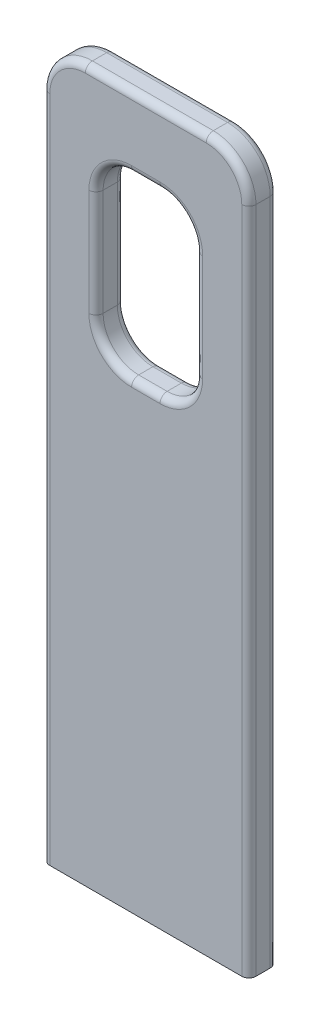
ISO-10303-21;
HEADER;
FILE_DESCRIPTION(('STEP AP214'),'2;1');
FILE_NAME('part.step','',(''),(''),'','','');
FILE_SCHEMA(('AUTOMOTIVE_DESIGN { 1 0 10303 214 1 1 1 1 }'));
ENDSEC;
DATA;
#1=APPLICATION_CONTEXT('core data for automotive mechanical design processes');
#2=APPLICATION_PROTOCOL_DEFINITION('international standard','automotive_design',2000,#1);
#3=PRODUCT_CONTEXT('',#1,'mechanical');
#4=PRODUCT('Part','Part','',(#3));
#5=PRODUCT_RELATED_PRODUCT_CATEGORY('part','',(#4));
#6=PRODUCT_DEFINITION_FORMATION('','',#4);
#7=PRODUCT_DEFINITION_CONTEXT('part definition',#1,'design');
#8=PRODUCT_DEFINITION('design','',#6,#7);
#9=PRODUCT_DEFINITION_SHAPE('','',#8);
#10=(LENGTH_UNIT() NAMED_UNIT(*) SI_UNIT(.MILLI.,.METRE.));
#11=(NAMED_UNIT(*) PLANE_ANGLE_UNIT() SI_UNIT($,.RADIAN.));
#12=(NAMED_UNIT(*) SI_UNIT($,.STERADIAN.) SOLID_ANGLE_UNIT());
#13=UNCERTAINTY_MEASURE_WITH_UNIT(LENGTH_MEASURE(1.E-05),#10,'distance_accuracy_value','');
#14=(GEOMETRIC_REPRESENTATION_CONTEXT(3) GLOBAL_UNCERTAINTY_ASSIGNED_CONTEXT((#13)) GLOBAL_UNIT_ASSIGNED_CONTEXT((#10,
#11,#12)) REPRESENTATION_CONTEXT('',''));
#15=CARTESIAN_POINT('',(0.,0.,0.));
#16=DIRECTION('',(0.,0.,1.));
#17=DIRECTION('',(1.,0.,0.));
#18=AXIS2_PLACEMENT_3D('',#15,#16,#17);
#19=CARTESIAN_POINT('',(-1.45,0.,0.2));
#20=DIRECTION('',(0.,0.,1.));
#21=DIRECTION('',(1.,0.,0.));
#22=AXIS2_PLACEMENT_3D('',#19,#20,#21);
#23=PLANE('',#22);
#24=DIRECTION('',(0.,-1.,0.));
#25=VECTOR('',#24,1.);
#26=CARTESIAN_POINT('',(-0.800000000000001,0.,0.2));
#27=LINE('',#26,#25);
#28=CARTESIAN_POINT('',(-0.8,7.,0.2));
#29=VERTEX_POINT('',#28);
#30=CARTESIAN_POINT('',(-0.8,8.5,0.2));
#31=VERTEX_POINT('',#30);
#32=EDGE_CURVE('E239',#29,#31,#27,.F.);
#33=ORIENTED_EDGE('',*,*,#32,.T.);
#34=CARTESIAN_POINT('',(-0.2,8.5,0.2));
#35=DIRECTION('',(0.,0.,1.));
#36=DIRECTION('',(1.,0.,0.));
#37=AXIS2_PLACEMENT_3D('',#34,#35,#36);
#38=CIRCLE('',#37,0.6);
#39=CARTESIAN_POINT('',(-0.2,9.1,0.2));
#40=VERTEX_POINT('',#39);
#41=EDGE_CURVE('E310',#31,#40,#38,.F.);
#42=ORIENTED_EDGE('',*,*,#41,.T.);
#43=DIRECTION('',(-1.,0.,0.));
#44=VECTOR('',#43,1.);
#45=CARTESIAN_POINT('',(-1.45,9.1,0.2));
#46=LINE('',#45,#44);
#47=CARTESIAN_POINT('',(0.2,9.1,0.2));
#48=VERTEX_POINT('',#47);
#49=EDGE_CURVE('E308',#40,#48,#46,.F.);
#50=ORIENTED_EDGE('',*,*,#49,.T.);
#51=CARTESIAN_POINT('',(0.2,8.5,0.2));
#52=DIRECTION('',(0.,0.,1.));
#53=DIRECTION('',(1.,0.,0.));
#54=AXIS2_PLACEMENT_3D('',#51,#52,#53);
#55=CIRCLE('',#54,0.6);
#56=CARTESIAN_POINT('',(0.8,8.5,0.2));
#57=VERTEX_POINT('',#56);
#58=EDGE_CURVE('E306',#48,#57,#55,.F.);
#59=ORIENTED_EDGE('',*,*,#58,.T.);
#60=DIRECTION('',(0.,1.,0.));
#61=VECTOR('',#60,1.);
#62=CARTESIAN_POINT('',(0.800000000000001,0.,0.2));
#63=LINE('',#62,#61);
#64=CARTESIAN_POINT('',(0.8,7.,0.2));
#65=VERTEX_POINT('',#64);
#66=EDGE_CURVE('E304',#57,#65,#63,.F.);
#67=ORIENTED_EDGE('',*,*,#66,.T.);
#68=CARTESIAN_POINT('',(0.2,7.,0.2));
#69=DIRECTION('',(0.,0.,1.));
#70=DIRECTION('',(1.,0.,0.));
#71=AXIS2_PLACEMENT_3D('',#68,#69,#70);
#72=CIRCLE('',#71,0.6);
#73=CARTESIAN_POINT('',(0.2,6.4,0.2));
#74=VERTEX_POINT('',#73);
#75=EDGE_CURVE('E302',#65,#74,#72,.F.);
#76=ORIENTED_EDGE('',*,*,#75,.T.);
#77=DIRECTION('',(1.,0.,0.));
#78=VECTOR('',#77,1.);
#79=CARTESIAN_POINT('',(-1.44999999999999,6.4,0.2));
#80=LINE('',#79,#78);
#81=CARTESIAN_POINT('',(-0.2,6.4,0.2));
#82=VERTEX_POINT('',#81);
#83=EDGE_CURVE('E300',#74,#82,#80,.F.);
#84=ORIENTED_EDGE('',*,*,#83,.T.);
#85=CARTESIAN_POINT('',(-0.2,7.,0.2));
#86=DIRECTION('',(0.,0.,1.));
#87=DIRECTION('',(1.,0.,0.));
#88=AXIS2_PLACEMENT_3D('',#85,#86,#87);
#89=CIRCLE('',#88,0.6);
#90=EDGE_CURVE('E298',#82,#29,#89,.F.);
#91=ORIENTED_EDGE('',*,*,#90,.T.);
#92=EDGE_LOOP('',(#33,#42,#50,#59,#67,#76,#84,#91));
#93=FACE_BOUND('',#92,.T.);
#94=CARTESIAN_POINT('',(-0.849999999999997,9.4,0.2));
#95=DIRECTION('',(0.,0.,1.));
#96=DIRECTION('',(1.,0.,0.));
#97=AXIS2_PLACEMENT_3D('',#94,#95,#96);
#98=CIRCLE('',#97,0.5);
#99=CARTESIAN_POINT('',(-0.849999999999997,9.9,0.2));
#100=VERTEX_POINT('',#99);
#101=CARTESIAN_POINT('',(-1.35,9.4,0.2));
#102=VERTEX_POINT('',#101);
#103=EDGE_CURVE('E237',#100,#102,#98,.T.);
#104=ORIENTED_EDGE('',*,*,#103,.T.);
#105=DIRECTION('',(0.,-1.,0.));
#106=VECTOR('',#105,1.);
#107=CARTESIAN_POINT('',(-1.35,0.,0.2));
#108=LINE('',#107,#106);
#109=CARTESIAN_POINT('',(-1.35,0.,0.2));
#110=VERTEX_POINT('',#109);
#111=EDGE_CURVE('E223',#102,#110,#108,.T.);
#112=ORIENTED_EDGE('',*,*,#111,.T.);
#113=DIRECTION('',(1.,0.,0.));
#114=VECTOR('',#113,1.);
#115=CARTESIAN_POINT('',(-1.45,0.,0.2));
#116=LINE('',#115,#114);
#117=CARTESIAN_POINT('',(1.35,0.,0.2));
#118=VERTEX_POINT('',#117);
#119=EDGE_CURVE('E234',#110,#118,#116,.T.);
#120=ORIENTED_EDGE('',*,*,#119,.T.);
#121=DIRECTION('',(0.,1.,0.));
#122=VECTOR('',#121,1.);
#123=CARTESIAN_POINT('',(1.35,9.4,0.2));
#124=LINE('',#123,#122);
#125=CARTESIAN_POINT('',(1.35,9.4,0.2));
#126=VERTEX_POINT('',#125);
#127=EDGE_CURVE('E290',#118,#126,#124,.T.);
#128=ORIENTED_EDGE('',*,*,#127,.T.);
#129=CARTESIAN_POINT('',(0.850000000000003,9.4,0.2));
#130=DIRECTION('',(0.,0.,1.));
#131=DIRECTION('',(1.,0.,0.));
#132=AXIS2_PLACEMENT_3D('',#129,#130,#131);
#133=CIRCLE('',#132,0.5);
#134=CARTESIAN_POINT('',(0.850000000000003,9.9,0.2));
#135=VERTEX_POINT('',#134);
#136=EDGE_CURVE('E292',#126,#135,#133,.T.);
#137=ORIENTED_EDGE('',*,*,#136,.T.);
#138=DIRECTION('',(-1.,0.,0.));
#139=VECTOR('',#138,1.);
#140=CARTESIAN_POINT('',(-0.849999999999997,9.9,0.2));
#141=LINE('',#140,#139);
#142=EDGE_CURVE('E294',#135,#100,#141,.T.);
#143=ORIENTED_EDGE('',*,*,#142,.T.);
#144=EDGE_LOOP('',(#104,#112,#120,#128,#137,#143));
#145=FACE_BOUND('',#144,.T.);
#146=ADVANCED_FACE('F32',(#93,#145),#23,.T.);
#147=CARTESIAN_POINT('',(-1.45,0.,-0.2));
#148=DIRECTION('',(0.,0.,1.));
#149=DIRECTION('',(1.,0.,0.));
#150=AXIS2_PLACEMENT_3D('',#147,#148,#149);
#151=PLANE('',#150);
#152=DIRECTION('',(-1.,0.,0.));
#153=VECTOR('',#152,1.);
#154=CARTESIAN_POINT('',(-0.2,9.1,-0.2));
#155=LINE('',#154,#153);
#156=CARTESIAN_POINT('',(0.2,9.1,-0.2));
#157=VERTEX_POINT('',#156);
#158=CARTESIAN_POINT('',(-0.2,9.1,-0.2));
#159=VERTEX_POINT('',#158);
#160=EDGE_CURVE('E365',#157,#159,#155,.T.);
#161=ORIENTED_EDGE('',*,*,#160,.T.);
#162=CARTESIAN_POINT('',(-0.2,8.5,-0.2));
#163=DIRECTION('',(0.,0.,1.));
#164=DIRECTION('',(1.,0.,0.));
#165=AXIS2_PLACEMENT_3D('',#162,#163,#164);
#166=CIRCLE('',#165,0.6);
#167=CARTESIAN_POINT('',(-0.8,8.5,-0.2));
#168=VERTEX_POINT('',#167);
#169=EDGE_CURVE('E367',#159,#168,#166,.T.);
#170=ORIENTED_EDGE('',*,*,#169,.T.);
#171=DIRECTION('',(0.,-1.,0.));
#172=VECTOR('',#171,1.);
#173=CARTESIAN_POINT('',(-0.8,7.,-0.2));
#174=LINE('',#173,#172);
#175=CARTESIAN_POINT('',(-0.8,7.,-0.2));
#176=VERTEX_POINT('',#175);
#177=EDGE_CURVE('E353',#168,#176,#174,.T.);
#178=ORIENTED_EDGE('',*,*,#177,.T.);
#179=CARTESIAN_POINT('',(-0.2,7.,-0.2));
#180=DIRECTION('',(0.,0.,1.));
#181=DIRECTION('',(1.,0.,0.));
#182=AXIS2_PLACEMENT_3D('',#179,#180,#181);
#183=CIRCLE('',#182,0.6);
#184=CARTESIAN_POINT('',(-0.2,6.4,-0.2));
#185=VERTEX_POINT('',#184);
#186=EDGE_CURVE('E355',#176,#185,#183,.T.);
#187=ORIENTED_EDGE('',*,*,#186,.T.);
#188=DIRECTION('',(1.,0.,0.));
#189=VECTOR('',#188,1.);
#190=CARTESIAN_POINT('',(0.2,6.4,-0.2));
#191=LINE('',#190,#189);
#192=CARTESIAN_POINT('',(0.2,6.4,-0.2));
#193=VERTEX_POINT('',#192);
#194=EDGE_CURVE('E357',#185,#193,#191,.T.);
#195=ORIENTED_EDGE('',*,*,#194,.T.);
#196=CARTESIAN_POINT('',(0.2,7.,-0.2));
#197=DIRECTION('',(0.,0.,1.));
#198=DIRECTION('',(1.,0.,0.));
#199=AXIS2_PLACEMENT_3D('',#196,#197,#198);
#200=CIRCLE('',#199,0.6);
#201=CARTESIAN_POINT('',(0.8,7.,-0.2));
#202=VERTEX_POINT('',#201);
#203=EDGE_CURVE('E359',#193,#202,#200,.T.);
#204=ORIENTED_EDGE('',*,*,#203,.T.);
#205=DIRECTION('',(0.,1.,0.));
#206=VECTOR('',#205,1.);
#207=CARTESIAN_POINT('',(0.8,8.5,-0.2));
#208=LINE('',#207,#206);
#209=CARTESIAN_POINT('',(0.8,8.5,-0.2));
#210=VERTEX_POINT('',#209);
#211=EDGE_CURVE('E361',#202,#210,#208,.T.);
#212=ORIENTED_EDGE('',*,*,#211,.T.);
#213=CARTESIAN_POINT('',(0.2,8.5,-0.2));
#214=DIRECTION('',(0.,0.,1.));
#215=DIRECTION('',(1.,0.,0.));
#216=AXIS2_PLACEMENT_3D('',#213,#214,#215);
#217=CIRCLE('',#216,0.6);
#218=EDGE_CURVE('E363',#210,#157,#217,.T.);
#219=ORIENTED_EDGE('',*,*,#218,.T.);
#220=EDGE_LOOP('',(#161,#170,#178,#187,#195,#204,#212,#219));
#221=FACE_BOUND('',#220,.T.);
#222=DIRECTION('',(1.,0.,0.));
#223=VECTOR('',#222,1.);
#224=CARTESIAN_POINT('',(-1.45,0.,-0.2));
#225=LINE('',#224,#223);
#226=CARTESIAN_POINT('',(-1.35,0.,-0.2));
#227=VERTEX_POINT('',#226);
#228=CARTESIAN_POINT('',(1.35,0.,-0.2));
#229=VERTEX_POINT('',#228);
#230=EDGE_CURVE('E246',#227,#229,#225,.T.);
#231=ORIENTED_EDGE('',*,*,#230,.F.);
#232=DIRECTION('',(0.,-1.,0.));
#233=VECTOR('',#232,1.);
#234=CARTESIAN_POINT('',(-1.35,0.,-0.2));
#235=LINE('',#234,#233);
#236=CARTESIAN_POINT('',(-1.35,9.4,-0.2));
#237=VERTEX_POINT('',#236);
#238=EDGE_CURVE('E351',#227,#237,#235,.F.);
#239=ORIENTED_EDGE('',*,*,#238,.T.);
#240=CARTESIAN_POINT('',(-0.849999999999997,9.4,-0.2));
#241=DIRECTION('',(0.,0.,1.));
#242=DIRECTION('',(1.,0.,0.));
#243=AXIS2_PLACEMENT_3D('',#240,#241,#242);
#244=CIRCLE('',#243,0.5);
#245=CARTESIAN_POINT('',(-0.849999999999997,9.9,-0.2));
#246=VERTEX_POINT('',#245);
#247=EDGE_CURVE('E349',#237,#246,#244,.F.);
#248=ORIENTED_EDGE('',*,*,#247,.T.);
#249=DIRECTION('',(-1.,0.,0.));
#250=VECTOR('',#249,1.);
#251=CARTESIAN_POINT('',(-1.45,9.9,-0.2));
#252=LINE('',#251,#250);
#253=CARTESIAN_POINT('',(0.850000000000003,9.9,-0.2));
#254=VERTEX_POINT('',#253);
#255=EDGE_CURVE('E347',#246,#254,#252,.F.);
#256=ORIENTED_EDGE('',*,*,#255,.T.);
#257=CARTESIAN_POINT('',(0.850000000000003,9.4,-0.2));
#258=DIRECTION('',(0.,0.,1.));
#259=DIRECTION('',(1.,0.,0.));
#260=AXIS2_PLACEMENT_3D('',#257,#258,#259);
#261=CIRCLE('',#260,0.5);
#262=CARTESIAN_POINT('',(1.35,9.4,-0.2));
#263=VERTEX_POINT('',#262);
#264=EDGE_CURVE('E345',#254,#263,#261,.F.);
#265=ORIENTED_EDGE('',*,*,#264,.T.);
#266=DIRECTION('',(0.,1.,0.));
#267=VECTOR('',#266,1.);
#268=CARTESIAN_POINT('',(1.35,0.,-0.2));
#269=LINE('',#268,#267);
#270=EDGE_CURVE('E343',#263,#229,#269,.F.);
#271=ORIENTED_EDGE('',*,*,#270,.T.);
#272=EDGE_LOOP('',(#231,#239,#248,#256,#265,#271));
#273=FACE_BOUND('',#272,.T.);
#274=ADVANCED_FACE('F503',(#221,#273),#151,.F.);
#275=CARTESIAN_POINT('',(-1.45,10.,0.2));
#276=DIRECTION('',(1.,0.,0.));
#277=DIRECTION('',(0.,1.,0.));
#278=AXIS2_PLACEMENT_3D('',#275,#276,#277);
#279=PLANE('',#278);
#280=DIRECTION('',(0.,0.,-1.));
#281=VECTOR('',#280,1.);
#282=CARTESIAN_POINT('',(-1.45,9.4,0.2));
#283=LINE('',#282,#281);
#284=CARTESIAN_POINT('',(-1.45,9.4,0.1));
#285=VERTEX_POINT('',#284);
#286=CARTESIAN_POINT('',(-1.45,9.4,-0.1));
#287=VERTEX_POINT('',#286);
#288=EDGE_CURVE('E287',#285,#287,#283,.T.);
#289=ORIENTED_EDGE('',*,*,#288,.T.);
#290=DIRECTION('',(0.,-1.,0.));
#291=VECTOR('',#290,1.);
#292=CARTESIAN_POINT('',(-1.45,10.,-0.1));
#293=LINE('',#292,#291);
#294=CARTESIAN_POINT('',(-1.45,0.,-0.1));
#295=VERTEX_POINT('',#294);
#296=EDGE_CURVE('E371',#287,#295,#293,.T.);
#297=ORIENTED_EDGE('',*,*,#296,.T.);
#298=DIRECTION('',(0.,0.,-1.));
#299=VECTOR('',#298,1.);
#300=CARTESIAN_POINT('',(-1.45,0.,0.2));
#301=LINE('',#300,#299);
#302=CARTESIAN_POINT('',(-1.45,0.,0.1));
#303=VERTEX_POINT('',#302);
#304=EDGE_CURVE('E248',#303,#295,#301,.T.);
#305=ORIENTED_EDGE('',*,*,#304,.F.);
#306=DIRECTION('',(0.,-1.,0.));
#307=VECTOR('',#306,1.);
#308=CARTESIAN_POINT('',(-1.45,9.4,0.1));
#309=LINE('',#308,#307);
#310=EDGE_CURVE('E224',#303,#285,#309,.F.);
#311=ORIENTED_EDGE('',*,*,#310,.T.);
#312=EDGE_LOOP('',(#289,#297,#305,#311));
#313=FACE_BOUND('',#312,.T.);
#314=ADVANCED_FACE('F494',(#313),#279,.F.);
#315=CARTESIAN_POINT('',(-1.45,0.,0.2));
#316=DIRECTION('',(0.,1.,0.));
#317=DIRECTION('',(0.,0.,1.));
#318=AXIS2_PLACEMENT_3D('',#315,#316,#317);
#319=PLANE('',#318);
#320=ORIENTED_EDGE('',*,*,#304,.T.);
#321=CARTESIAN_POINT('',(-1.35,0.,-0.1));
#322=DIRECTION('',(0.,1.,0.));
#323=DIRECTION('',(0.,0.,1.));
#324=AXIS2_PLACEMENT_3D('',#321,#322,#323);
#325=CIRCLE('',#324,0.1);
#326=EDGE_CURVE('E229',#295,#227,#325,.F.);
#327=ORIENTED_EDGE('',*,*,#326,.T.);
#328=ORIENTED_EDGE('',*,*,#230,.T.);
#329=CARTESIAN_POINT('',(1.35,0.,-0.1));
#330=DIRECTION('',(0.,1.,0.));
#331=DIRECTION('',(0.,0.,1.));
#332=AXIS2_PLACEMENT_3D('',#329,#330,#331);
#333=CIRCLE('',#332,0.1);
#334=CARTESIAN_POINT('',(1.45,0.,-0.1));
#335=VERTEX_POINT('',#334);
#336=EDGE_CURVE('E230',#229,#335,#333,.F.);
#337=ORIENTED_EDGE('',*,*,#336,.T.);
#338=DIRECTION('',(0.,0.,-1.));
#339=VECTOR('',#338,1.);
#340=CARTESIAN_POINT('',(1.45,0.,0.2));
#341=LINE('',#340,#339);
#342=CARTESIAN_POINT('',(1.45,0.,0.1));
#343=VERTEX_POINT('',#342);
#344=EDGE_CURVE('E245',#343,#335,#341,.T.);
#345=ORIENTED_EDGE('',*,*,#344,.F.);
#346=CARTESIAN_POINT('',(1.35,0.,0.1));
#347=DIRECTION('',(0.,1.,0.));
#348=DIRECTION('',(0.,0.,1.));
#349=AXIS2_PLACEMENT_3D('',#346,#347,#348);
#350=CIRCLE('',#349,0.1);
#351=EDGE_CURVE('E244',#343,#118,#350,.F.);
#352=ORIENTED_EDGE('',*,*,#351,.T.);
#353=ORIENTED_EDGE('',*,*,#119,.F.);
#354=CARTESIAN_POINT('',(-1.35,0.,0.1));
#355=DIRECTION('',(0.,1.,0.));
#356=DIRECTION('',(0.,0.,1.));
#357=AXIS2_PLACEMENT_3D('',#354,#355,#356);
#358=CIRCLE('',#357,0.1);
#359=EDGE_CURVE('E219',#110,#303,#358,.F.);
#360=ORIENTED_EDGE('',*,*,#359,.T.);
#361=EDGE_LOOP('',(#320,#327,#328,#337,#345,#352,#353,#360));
#362=FACE_BOUND('',#361,.T.);
#363=ADVANCED_FACE('F241',(#362),#319,.F.);
#364=CARTESIAN_POINT('',(1.45,10.,0.2));
#365=DIRECTION('',(-1.,0.,0.));
#366=DIRECTION('',(0.,-1.,0.));
#367=AXIS2_PLACEMENT_3D('',#364,#365,#366);
#368=PLANE('',#367);
#369=ORIENTED_EDGE('',*,*,#344,.T.);
#370=DIRECTION('',(0.,1.,0.));
#371=VECTOR('',#370,1.);
#372=CARTESIAN_POINT('',(1.45,10.,-0.1));
#373=LINE('',#372,#371);
#374=CARTESIAN_POINT('',(1.45,9.4,-0.1));
#375=VERTEX_POINT('',#374);
#376=EDGE_CURVE('E11',#335,#375,#373,.T.);
#377=ORIENTED_EDGE('',*,*,#376,.T.);
#378=DIRECTION('',(0.,0.,-1.));
#379=VECTOR('',#378,1.);
#380=CARTESIAN_POINT('',(1.45,9.4,0.2));
#381=LINE('',#380,#379);
#382=CARTESIAN_POINT('',(1.45,9.4,0.1));
#383=VERTEX_POINT('',#382);
#384=EDGE_CURVE('E285',#375,#383,#381,.F.);
#385=ORIENTED_EDGE('',*,*,#384,.T.);
#386=DIRECTION('',(0.,1.,0.));
#387=VECTOR('',#386,1.);
#388=CARTESIAN_POINT('',(1.45,0.,0.1));
#389=LINE('',#388,#387);
#390=EDGE_CURVE('E41',#383,#343,#389,.F.);
#391=ORIENTED_EDGE('',*,*,#390,.T.);
#392=EDGE_LOOP('',(#369,#377,#385,#391));
#393=FACE_BOUND('',#392,.T.);
#394=ADVANCED_FACE('F465',(#393),#368,.F.);
#395=CARTESIAN_POINT('',(-1.45,10.,0.2));
#396=DIRECTION('',(0.,-1.,0.));
#397=DIRECTION('',(0.,0.,-1.));
#398=AXIS2_PLACEMENT_3D('',#395,#396,#397);
#399=PLANE('',#398);
#400=DIRECTION('',(0.,0.,-1.));
#401=VECTOR('',#400,1.);
#402=CARTESIAN_POINT('',(0.850000000000003,10.,0.2));
#403=LINE('',#402,#401);
#404=CARTESIAN_POINT('',(0.850000000000003,10.,0.1));
#405=VERTEX_POINT('',#404);
#406=CARTESIAN_POINT('',(0.850000000000003,10.,-0.1));
#407=VERTEX_POINT('',#406);
#408=EDGE_CURVE('E282',#405,#407,#403,.T.);
#409=ORIENTED_EDGE('',*,*,#408,.T.);
#410=DIRECTION('',(-1.,0.,0.));
#411=VECTOR('',#410,1.);
#412=CARTESIAN_POINT('',(-1.45,10.,-0.1));
#413=LINE('',#412,#411);
#414=CARTESIAN_POINT('',(-0.849999999999997,10.,-0.1));
#415=VERTEX_POINT('',#414);
#416=EDGE_CURVE('E383',#407,#415,#413,.T.);
#417=ORIENTED_EDGE('',*,*,#416,.T.);
#418=DIRECTION('',(0.,0.,-1.));
#419=VECTOR('',#418,1.);
#420=CARTESIAN_POINT('',(-0.849999999999997,10.,0.2));
#421=LINE('',#420,#419);
#422=CARTESIAN_POINT('',(-0.849999999999997,10.,0.1));
#423=VERTEX_POINT('',#422);
#424=EDGE_CURVE('E279',#415,#423,#421,.F.);
#425=ORIENTED_EDGE('',*,*,#424,.T.);
#426=DIRECTION('',(-1.,0.,0.));
#427=VECTOR('',#426,1.);
#428=CARTESIAN_POINT('',(0.850000000000003,10.,0.1));
#429=LINE('',#428,#427);
#430=EDGE_CURVE('E381',#423,#405,#429,.F.);
#431=ORIENTED_EDGE('',*,*,#430,.T.);
#432=EDGE_LOOP('',(#409,#417,#425,#431));
#433=FACE_BOUND('',#432,.T.);
#434=ADVANCED_FACE('F480',(#433),#399,.F.);
#435=CARTESIAN_POINT('',(-0.7,9.,0.2));
#436=DIRECTION('',(1.,0.,0.));
#437=DIRECTION('',(0.,1.,0.));
#438=AXIS2_PLACEMENT_3D('',#435,#436,#437);
#439=PLANE('',#438);
#440=DIRECTION('',(0.,0.,-1.));
#441=VECTOR('',#440,1.);
#442=CARTESIAN_POINT('',(-0.7,8.5,0.2));
#443=LINE('',#442,#441);
#444=CARTESIAN_POINT('',(-0.7,8.5,-0.1));
#445=VERTEX_POINT('',#444);
#446=CARTESIAN_POINT('',(-0.7,8.5,0.1));
#447=VERTEX_POINT('',#446);
#448=EDGE_CURVE('E276',#445,#447,#443,.F.);
#449=ORIENTED_EDGE('',*,*,#448,.T.);
#450=DIRECTION('',(0.,-1.,0.));
#451=VECTOR('',#450,1.);
#452=CARTESIAN_POINT('',(-0.7,9.,0.1));
#453=LINE('',#452,#451);
#454=CARTESIAN_POINT('',(-0.7,7.,0.1));
#455=VERTEX_POINT('',#454);
#456=EDGE_CURVE('E390',#447,#455,#453,.T.);
#457=ORIENTED_EDGE('',*,*,#456,.T.);
#458=DIRECTION('',(0.,0.,-1.));
#459=VECTOR('',#458,1.);
#460=CARTESIAN_POINT('',(-0.7,7.,-0.2));
#461=LINE('',#460,#459);
#462=CARTESIAN_POINT('',(-0.7,7.,-0.1));
#463=VERTEX_POINT('',#462);
#464=EDGE_CURVE('E273',#455,#463,#461,.T.);
#465=ORIENTED_EDGE('',*,*,#464,.T.);
#466=DIRECTION('',(0.,-1.,0.));
#467=VECTOR('',#466,1.);
#468=CARTESIAN_POINT('',(-0.7,8.5,-0.1));
#469=LINE('',#468,#467);
#470=EDGE_CURVE('E388',#463,#445,#469,.F.);
#471=ORIENTED_EDGE('',*,*,#470,.T.);
#472=EDGE_LOOP('',(#449,#457,#465,#471));
#473=FACE_BOUND('',#472,.T.);
#474=ADVANCED_FACE('F524',(#473),#439,.T.);
#475=CARTESIAN_POINT('',(-0.7,6.5,0.2));
#476=DIRECTION('',(0.,1.,0.));
#477=DIRECTION('',(-1.,0.,0.));
#478=AXIS2_PLACEMENT_3D('',#475,#476,#477);
#479=PLANE('',#478);
#480=DIRECTION('',(0.,0.,-1.));
#481=VECTOR('',#480,1.);
#482=CARTESIAN_POINT('',(-0.2,6.5,0.2));
#483=LINE('',#482,#481);
#484=CARTESIAN_POINT('',(-0.2,6.5,-0.1));
#485=VERTEX_POINT('',#484);
#486=CARTESIAN_POINT('',(-0.2,6.5,0.1));
#487=VERTEX_POINT('',#486);
#488=EDGE_CURVE('E255',#485,#487,#483,.F.);
#489=ORIENTED_EDGE('',*,*,#488,.T.);
#490=DIRECTION('',(1.,0.,0.));
#491=VECTOR('',#490,1.);
#492=CARTESIAN_POINT('',(-0.7,6.5,0.1));
#493=LINE('',#492,#491);
#494=CARTESIAN_POINT('',(0.2,6.5,0.1));
#495=VERTEX_POINT('',#494);
#496=EDGE_CURVE('E337',#487,#495,#493,.T.);
#497=ORIENTED_EDGE('',*,*,#496,.T.);
#498=DIRECTION('',(0.,0.,-1.));
#499=VECTOR('',#498,1.);
#500=CARTESIAN_POINT('',(0.2,6.5,-0.2));
#501=LINE('',#500,#499);
#502=CARTESIAN_POINT('',(0.2,6.5,-0.1));
#503=VERTEX_POINT('',#502);
#504=EDGE_CURVE('E258',#495,#503,#501,.T.);
#505=ORIENTED_EDGE('',*,*,#504,.T.);
#506=DIRECTION('',(1.,0.,0.));
#507=VECTOR('',#506,1.);
#508=CARTESIAN_POINT('',(-0.2,6.5,-0.1));
#509=LINE('',#508,#507);
#510=EDGE_CURVE('E335',#503,#485,#509,.F.);
#511=ORIENTED_EDGE('',*,*,#510,.T.);
#512=EDGE_LOOP('',(#489,#497,#505,#511));
#513=FACE_BOUND('',#512,.T.);
#514=ADVANCED_FACE('F827',(#513),#479,.T.);
#515=CARTESIAN_POINT('',(0.7,9.,0.2));
#516=DIRECTION('',(-1.,0.,0.));
#517=DIRECTION('',(0.,-1.,0.));
#518=AXIS2_PLACEMENT_3D('',#515,#516,#517);
#519=PLANE('',#518);
#520=DIRECTION('',(0.,0.,-1.));
#521=VECTOR('',#520,1.);
#522=CARTESIAN_POINT('',(0.7,7.,0.2));
#523=LINE('',#522,#521);
#524=CARTESIAN_POINT('',(0.7,7.,-0.1));
#525=VERTEX_POINT('',#524);
#526=CARTESIAN_POINT('',(0.7,7.,0.1));
#527=VERTEX_POINT('',#526);
#528=EDGE_CURVE('E264',#525,#527,#523,.F.);
#529=ORIENTED_EDGE('',*,*,#528,.T.);
#530=DIRECTION('',(0.,1.,0.));
#531=VECTOR('',#530,1.);
#532=CARTESIAN_POINT('',(0.7,9.,0.1));
#533=LINE('',#532,#531);
#534=CARTESIAN_POINT('',(0.7,8.5,0.1));
#535=VERTEX_POINT('',#534);
#536=EDGE_CURVE('E329',#527,#535,#533,.T.);
#537=ORIENTED_EDGE('',*,*,#536,.T.);
#538=DIRECTION('',(0.,0.,-1.));
#539=VECTOR('',#538,1.);
#540=CARTESIAN_POINT('',(0.7,8.5,-0.2));
#541=LINE('',#540,#539);
#542=CARTESIAN_POINT('',(0.7,8.5,-0.1));
#543=VERTEX_POINT('',#542);
#544=EDGE_CURVE('E261',#535,#543,#541,.T.);
#545=ORIENTED_EDGE('',*,*,#544,.T.);
#546=DIRECTION('',(0.,1.,0.));
#547=VECTOR('',#546,1.);
#548=CARTESIAN_POINT('',(0.7,7.,-0.1));
#549=LINE('',#548,#547);
#550=EDGE_CURVE('E327',#543,#525,#549,.F.);
#551=ORIENTED_EDGE('',*,*,#550,.T.);
#552=EDGE_LOOP('',(#529,#537,#545,#551));
#553=FACE_BOUND('',#552,.T.);
#554=ADVANCED_FACE('F819',(#553),#519,.T.);
#555=CARTESIAN_POINT('',(-0.7,9.,0.2));
#556=DIRECTION('',(0.,-1.,0.));
#557=DIRECTION('',(0.,0.,-1.));
#558=AXIS2_PLACEMENT_3D('',#555,#556,#557);
#559=PLANE('',#558);
#560=DIRECTION('',(0.,0.,-1.));
#561=VECTOR('',#560,1.);
#562=CARTESIAN_POINT('',(0.2,9.,0.2));
#563=LINE('',#562,#561);
#564=CARTESIAN_POINT('',(0.2,9.,-0.1));
#565=VERTEX_POINT('',#564);
#566=CARTESIAN_POINT('',(0.2,9.,0.1));
#567=VERTEX_POINT('',#566);
#568=EDGE_CURVE('E270',#565,#567,#563,.F.);
#569=ORIENTED_EDGE('',*,*,#568,.T.);
#570=DIRECTION('',(-1.,0.,0.));
#571=VECTOR('',#570,1.);
#572=CARTESIAN_POINT('',(-0.7,9.,0.1));
#573=LINE('',#572,#571);
#574=CARTESIAN_POINT('',(-0.2,9.,0.1));
#575=VERTEX_POINT('',#574);
#576=EDGE_CURVE('E321',#567,#575,#573,.T.);
#577=ORIENTED_EDGE('',*,*,#576,.T.);
#578=DIRECTION('',(0.,0.,-1.));
#579=VECTOR('',#578,1.);
#580=CARTESIAN_POINT('',(-0.2,9.,-0.2));
#581=LINE('',#580,#579);
#582=CARTESIAN_POINT('',(-0.2,9.,-0.1));
#583=VERTEX_POINT('',#582);
#584=EDGE_CURVE('E267',#575,#583,#581,.T.);
#585=ORIENTED_EDGE('',*,*,#584,.T.);
#586=DIRECTION('',(-1.,0.,0.));
#587=VECTOR('',#586,1.);
#588=CARTESIAN_POINT('',(0.2,9.,-0.1));
#589=LINE('',#588,#587);
#590=EDGE_CURVE('E319',#583,#565,#589,.F.);
#591=ORIENTED_EDGE('',*,*,#590,.T.);
#592=EDGE_LOOP('',(#569,#577,#585,#591));
#593=FACE_BOUND('',#592,.T.);
#594=ADVANCED_FACE('F539',(#593),#559,.T.);
#595=CARTESIAN_POINT('',(0.2,7.,0.2));
#596=DIRECTION('',(0.,0.,1.));
#597=DIRECTION('',(1.,0.,0.));
#598=AXIS2_PLACEMENT_3D('',#595,#596,#597);
#599=CYLINDRICAL_SURFACE('',#598,0.5);
#600=ORIENTED_EDGE('',*,*,#504,.F.);
#601=CARTESIAN_POINT('',(0.2,7.,0.1));
#602=DIRECTION('',(0.,0.,1.));
#603=DIRECTION('',(1.,0.,0.));
#604=AXIS2_PLACEMENT_3D('',#601,#602,#603);
#605=CIRCLE('',#604,0.5);
#606=EDGE_CURVE('E333',#495,#527,#605,.T.);
#607=ORIENTED_EDGE('',*,*,#606,.T.);
#608=ORIENTED_EDGE('',*,*,#528,.F.);
#609=CARTESIAN_POINT('',(0.2,7.,-0.1));
#610=DIRECTION('',(0.,0.,1.));
#611=DIRECTION('',(1.,0.,0.));
#612=AXIS2_PLACEMENT_3D('',#609,#610,#611);
#613=CIRCLE('',#612,0.5);
#614=EDGE_CURVE('E331',#525,#503,#613,.F.);
#615=ORIENTED_EDGE('',*,*,#614,.T.);
#616=EDGE_LOOP('',(#600,#607,#608,#615));
#617=FACE_BOUND('',#616,.T.);
#618=ADVANCED_FACE('F535',(#617),#599,.F.);
#619=CARTESIAN_POINT('',(0.2,8.5,0.2));
#620=DIRECTION('',(0.,0.,1.));
#621=DIRECTION('',(1.,0.,0.));
#622=AXIS2_PLACEMENT_3D('',#619,#620,#621);
#623=CYLINDRICAL_SURFACE('',#622,0.5);
#624=ORIENTED_EDGE('',*,*,#544,.F.);
#625=CARTESIAN_POINT('',(0.2,8.5,0.1));
#626=DIRECTION('',(0.,0.,1.));
#627=DIRECTION('',(1.,0.,0.));
#628=AXIS2_PLACEMENT_3D('',#625,#626,#627);
#629=CIRCLE('',#628,0.5);
#630=EDGE_CURVE('E325',#535,#567,#629,.T.);
#631=ORIENTED_EDGE('',*,*,#630,.T.);
#632=ORIENTED_EDGE('',*,*,#568,.F.);
#633=CARTESIAN_POINT('',(0.2,8.5,-0.1));
#634=DIRECTION('',(0.,0.,1.));
#635=DIRECTION('',(1.,0.,0.));
#636=AXIS2_PLACEMENT_3D('',#633,#634,#635);
#637=CIRCLE('',#636,0.5);
#638=EDGE_CURVE('E323',#565,#543,#637,.F.);
#639=ORIENTED_EDGE('',*,*,#638,.T.);
#640=EDGE_LOOP('',(#624,#631,#632,#639));
#641=FACE_BOUND('',#640,.T.);
#642=ADVANCED_FACE('F538',(#641),#623,.F.);
#643=CARTESIAN_POINT('',(-0.2,8.5,0.2));
#644=DIRECTION('',(0.,0.,1.));
#645=DIRECTION('',(1.,0.,0.));
#646=AXIS2_PLACEMENT_3D('',#643,#644,#645);
#647=CYLINDRICAL_SURFACE('',#646,0.5);
#648=ORIENTED_EDGE('',*,*,#584,.F.);
#649=CARTESIAN_POINT('',(-0.2,8.5,0.1));
#650=DIRECTION('',(0.,0.,1.));
#651=DIRECTION('',(1.,0.,0.));
#652=AXIS2_PLACEMENT_3D('',#649,#650,#651);
#653=CIRCLE('',#652,0.5);
#654=EDGE_CURVE('E316',#575,#447,#653,.T.);
#655=ORIENTED_EDGE('',*,*,#654,.T.);
#656=ORIENTED_EDGE('',*,*,#448,.F.);
#657=CARTESIAN_POINT('',(-0.2,8.5,-0.1));
#658=DIRECTION('',(0.,0.,1.));
#659=DIRECTION('',(1.,0.,0.));
#660=AXIS2_PLACEMENT_3D('',#657,#658,#659);
#661=CIRCLE('',#660,0.5);
#662=EDGE_CURVE('E313',#445,#583,#661,.F.);
#663=ORIENTED_EDGE('',*,*,#662,.T.);
#664=EDGE_LOOP('',(#648,#655,#656,#663));
#665=FACE_BOUND('',#664,.T.);
#666=ADVANCED_FACE('F543',(#665),#647,.F.);
#667=CARTESIAN_POINT('',(-0.2,7.,0.2));
#668=DIRECTION('',(0.,0.,1.));
#669=DIRECTION('',(1.,0.,0.));
#670=AXIS2_PLACEMENT_3D('',#667,#668,#669);
#671=CYLINDRICAL_SURFACE('',#670,0.5);
#672=ORIENTED_EDGE('',*,*,#464,.F.);
#673=CARTESIAN_POINT('',(-0.2,7.,0.1));
#674=DIRECTION('',(0.,0.,1.));
#675=DIRECTION('',(1.,0.,0.));
#676=AXIS2_PLACEMENT_3D('',#673,#674,#675);
#677=CIRCLE('',#676,0.5);
#678=EDGE_CURVE('E341',#455,#487,#677,.T.);
#679=ORIENTED_EDGE('',*,*,#678,.T.);
#680=ORIENTED_EDGE('',*,*,#488,.F.);
#681=CARTESIAN_POINT('',(-0.2,7.,-0.1));
#682=DIRECTION('',(0.,0.,1.));
#683=DIRECTION('',(1.,0.,0.));
#684=AXIS2_PLACEMENT_3D('',#681,#682,#683);
#685=CIRCLE('',#684,0.5);
#686=EDGE_CURVE('E339',#485,#463,#685,.F.);
#687=ORIENTED_EDGE('',*,*,#686,.T.);
#688=EDGE_LOOP('',(#672,#679,#680,#687));
#689=FACE_BOUND('',#688,.T.);
#690=ADVANCED_FACE('F547',(#689),#671,.F.);
#691=CARTESIAN_POINT('',(0.850000000000003,9.4,0.2));
#692=DIRECTION('',(0.,0.,-1.));
#693=DIRECTION('',(-1.,0.,0.));
#694=AXIS2_PLACEMENT_3D('',#691,#692,#693);
#695=CYLINDRICAL_SURFACE('',#694,0.6);
#696=ORIENTED_EDGE('',*,*,#384,.F.);
#697=CARTESIAN_POINT('',(0.850000000000003,9.4,-0.1));
#698=DIRECTION('',(0.,0.,1.));
#699=DIRECTION('',(1.,0.,0.));
#700=AXIS2_PLACEMENT_3D('',#697,#698,#699);
#701=CIRCLE('',#700,0.6);
#702=EDGE_CURVE('E386',#375,#407,#701,.T.);
#703=ORIENTED_EDGE('',*,*,#702,.T.);
#704=ORIENTED_EDGE('',*,*,#408,.F.);
#705=CARTESIAN_POINT('',(0.850000000000003,9.4,0.1));
#706=DIRECTION('',(0.,0.,1.));
#707=DIRECTION('',(1.,0.,0.));
#708=AXIS2_PLACEMENT_3D('',#705,#706,#707);
#709=CIRCLE('',#708,0.6);
#710=EDGE_CURVE('E49',#405,#383,#709,.F.);
#711=ORIENTED_EDGE('',*,*,#710,.T.);
#712=EDGE_LOOP('',(#696,#703,#704,#711));
#713=FACE_BOUND('',#712,.T.);
#714=ADVANCED_FACE('F478',(#713),#695,.T.);
#715=CARTESIAN_POINT('',(-0.849999999999997,9.4,0.2));
#716=DIRECTION('',(0.,0.,-1.));
#717=DIRECTION('',(-1.,0.,0.));
#718=AXIS2_PLACEMENT_3D('',#715,#716,#717);
#719=CYLINDRICAL_SURFACE('',#718,0.6);
#720=ORIENTED_EDGE('',*,*,#424,.F.);
#721=CARTESIAN_POINT('',(-0.849999999999997,9.4,-0.1));
#722=DIRECTION('',(0.,0.,1.));
#723=DIRECTION('',(1.,0.,0.));
#724=AXIS2_PLACEMENT_3D('',#721,#722,#723);
#725=CIRCLE('',#724,0.6);
#726=EDGE_CURVE('E379',#415,#287,#725,.T.);
#727=ORIENTED_EDGE('',*,*,#726,.T.);
#728=ORIENTED_EDGE('',*,*,#288,.F.);
#729=CARTESIAN_POINT('',(-0.849999999999997,9.4,0.1));
#730=DIRECTION('',(0.,0.,1.));
#731=DIRECTION('',(1.,0.,0.));
#732=AXIS2_PLACEMENT_3D('',#729,#730,#731);
#733=CIRCLE('',#732,0.6);
#734=EDGE_CURVE('E377',#285,#423,#733,.F.);
#735=ORIENTED_EDGE('',*,*,#734,.T.);
#736=EDGE_LOOP('',(#720,#727,#728,#735));
#737=FACE_BOUND('',#736,.T.);
#738=ADVANCED_FACE('F489',(#737),#719,.T.);
#739=CARTESIAN_POINT('',(0.2,7.,0.1));
#740=DIRECTION('',(0.,0.,1.));
#741=DIRECTION('',(1.,0.,0.));
#742=AXIS2_PLACEMENT_3D('',#739,#740,#741);
#743=TOROIDAL_SURFACE('',#742,0.6,0.1);
#744=CARTESIAN_POINT('',(0.8,7.,0.1));
#745=DIRECTION('',(0.,1.,0.));
#746=DIRECTION('',(0.,0.,1.));
#747=AXIS2_PLACEMENT_3D('',#744,#745,#746);
#748=CIRCLE('',#747,0.1);
#749=EDGE_CURVE('E410',#527,#65,#748,.T.);
#750=ORIENTED_EDGE('',*,*,#749,.F.);
#751=ORIENTED_EDGE('',*,*,#606,.F.);
#752=CARTESIAN_POINT('',(0.2,6.4,0.1));
#753=DIRECTION('',(-1.,0.,0.));
#754=DIRECTION('',(0.,-1.,0.));
#755=AXIS2_PLACEMENT_3D('',#752,#753,#754);
#756=CIRCLE('',#755,0.1);
#757=EDGE_CURVE('E251',#74,#495,#756,.T.);
#758=ORIENTED_EDGE('',*,*,#757,.F.);
#759=ORIENTED_EDGE('',*,*,#75,.F.);
#760=EDGE_LOOP('',(#750,#751,#758,#759));
#761=FACE_BOUND('',#760,.T.);
#762=ADVANCED_FACE('F556',(#761),#743,.T.);
#763=CARTESIAN_POINT('',(-0.7,6.4,0.1));
#764=DIRECTION('',(1.,0.,0.));
#765=DIRECTION('',(0.,1.,0.));
#766=AXIS2_PLACEMENT_3D('',#763,#764,#765);
#767=CYLINDRICAL_SURFACE('',#766,0.1);
#768=ORIENTED_EDGE('',*,*,#757,.T.);
#769=ORIENTED_EDGE('',*,*,#496,.F.);
#770=CARTESIAN_POINT('',(-0.2,6.4,0.1));
#771=DIRECTION('',(-1.,0.,0.));
#772=DIRECTION('',(0.,-1.,0.));
#773=AXIS2_PLACEMENT_3D('',#770,#771,#772);
#774=CIRCLE('',#773,0.1);
#775=EDGE_CURVE('E407',#82,#487,#774,.T.);
#776=ORIENTED_EDGE('',*,*,#775,.F.);
#777=ORIENTED_EDGE('',*,*,#83,.F.);
#778=EDGE_LOOP('',(#768,#769,#776,#777));
#779=FACE_BOUND('',#778,.T.);
#780=ADVANCED_FACE('F581',(#779),#767,.T.);
#781=CARTESIAN_POINT('',(0.8,9.,0.1));
#782=DIRECTION('',(0.,1.,0.));
#783=DIRECTION('',(-1.,0.,0.));
#784=AXIS2_PLACEMENT_3D('',#781,#782,#783);
#785=CYLINDRICAL_SURFACE('',#784,0.1);
#786=ORIENTED_EDGE('',*,*,#749,.T.);
#787=ORIENTED_EDGE('',*,*,#66,.F.);
#788=CARTESIAN_POINT('',(0.8,8.5,0.1));
#789=DIRECTION('',(0.,1.,0.));
#790=DIRECTION('',(0.,0.,1.));
#791=AXIS2_PLACEMENT_3D('',#788,#789,#790);
#792=CIRCLE('',#791,0.1);
#793=EDGE_CURVE('E404',#535,#57,#792,.T.);
#794=ORIENTED_EDGE('',*,*,#793,.F.);
#795=ORIENTED_EDGE('',*,*,#536,.F.);
#796=EDGE_LOOP('',(#786,#787,#794,#795));
#797=FACE_BOUND('',#796,.T.);
#798=ADVANCED_FACE('F577',(#797),#785,.T.);
#799=CARTESIAN_POINT('',(-0.2,7.,0.1));
#800=DIRECTION('',(0.,0.,1.));
#801=DIRECTION('',(1.,0.,0.));
#802=AXIS2_PLACEMENT_3D('',#799,#800,#801);
#803=TOROIDAL_SURFACE('',#802,0.6,0.1);
#804=ORIENTED_EDGE('',*,*,#775,.T.);
#805=ORIENTED_EDGE('',*,*,#678,.F.);
#806=CARTESIAN_POINT('',(-0.8,7.,0.1));
#807=DIRECTION('',(0.,1.,0.));
#808=DIRECTION('',(0.,0.,1.));
#809=AXIS2_PLACEMENT_3D('',#806,#807,#808);
#810=CIRCLE('',#809,0.1);
#811=EDGE_CURVE('E401',#29,#455,#810,.T.);
#812=ORIENTED_EDGE('',*,*,#811,.F.);
#813=ORIENTED_EDGE('',*,*,#90,.F.);
#814=EDGE_LOOP('',(#804,#805,#812,#813));
#815=FACE_BOUND('',#814,.T.);
#816=ADVANCED_FACE('F573',(#815),#803,.T.);
#817=CARTESIAN_POINT('',(0.2,8.5,0.1));
#818=DIRECTION('',(0.,0.,1.));
#819=DIRECTION('',(1.,0.,0.));
#820=AXIS2_PLACEMENT_3D('',#817,#818,#819);
#821=TOROIDAL_SURFACE('',#820,0.6,0.1);
#822=ORIENTED_EDGE('',*,*,#793,.T.);
#823=ORIENTED_EDGE('',*,*,#58,.F.);
#824=CARTESIAN_POINT('',(0.2,9.1,0.1));
#825=DIRECTION('',(-1.,0.,0.));
#826=DIRECTION('',(0.,0.,1.));
#827=AXIS2_PLACEMENT_3D('',#824,#825,#826);
#828=CIRCLE('',#827,0.1);
#829=EDGE_CURVE('E398',#567,#48,#828,.T.);
#830=ORIENTED_EDGE('',*,*,#829,.F.);
#831=ORIENTED_EDGE('',*,*,#630,.F.);
#832=EDGE_LOOP('',(#822,#823,#830,#831));
#833=FACE_BOUND('',#832,.T.);
#834=ADVANCED_FACE('F569',(#833),#821,.T.);
#835=CARTESIAN_POINT('',(-0.8,9.,0.1));
#836=DIRECTION('',(0.,-1.,0.));
#837=DIRECTION('',(1.,0.,0.));
#838=AXIS2_PLACEMENT_3D('',#835,#836,#837);
#839=CYLINDRICAL_SURFACE('',#838,0.1);
#840=ORIENTED_EDGE('',*,*,#811,.T.);
#841=ORIENTED_EDGE('',*,*,#456,.F.);
#842=CARTESIAN_POINT('',(-0.8,8.5,0.1));
#843=DIRECTION('',(0.,1.,0.));
#844=DIRECTION('',(0.,0.,1.));
#845=AXIS2_PLACEMENT_3D('',#842,#843,#844);
#846=CIRCLE('',#845,0.1);
#847=EDGE_CURVE('E395',#31,#447,#846,.T.);
#848=ORIENTED_EDGE('',*,*,#847,.F.);
#849=ORIENTED_EDGE('',*,*,#32,.F.);
#850=EDGE_LOOP('',(#840,#841,#848,#849));
#851=FACE_BOUND('',#850,.T.);
#852=ADVANCED_FACE('F565',(#851),#839,.T.);
#853=CARTESIAN_POINT('',(-0.7,9.1,0.1));
#854=DIRECTION('',(-1.,0.,0.));
#855=DIRECTION('',(0.,0.,1.));
#856=AXIS2_PLACEMENT_3D('',#853,#854,#855);
#857=CYLINDRICAL_SURFACE('',#856,0.1);
#858=ORIENTED_EDGE('',*,*,#829,.T.);
#859=ORIENTED_EDGE('',*,*,#49,.F.);
#860=CARTESIAN_POINT('',(-0.2,9.1,0.1));
#861=DIRECTION('',(-1.,0.,0.));
#862=DIRECTION('',(0.,0.,1.));
#863=AXIS2_PLACEMENT_3D('',#860,#861,#862);
#864=CIRCLE('',#863,0.1);
#865=EDGE_CURVE('E393',#575,#40,#864,.T.);
#866=ORIENTED_EDGE('',*,*,#865,.F.);
#867=ORIENTED_EDGE('',*,*,#576,.F.);
#868=EDGE_LOOP('',(#858,#859,#866,#867));
#869=FACE_BOUND('',#868,.T.);
#870=ADVANCED_FACE('F561',(#869),#857,.T.);
#871=CARTESIAN_POINT('',(-0.2,8.5,0.1));
#872=DIRECTION('',(0.,0.,1.));
#873=DIRECTION('',(1.,0.,0.));
#874=AXIS2_PLACEMENT_3D('',#871,#872,#873);
#875=TOROIDAL_SURFACE('',#874,0.6,0.1);
#876=ORIENTED_EDGE('',*,*,#847,.T.);
#877=ORIENTED_EDGE('',*,*,#654,.F.);
#878=ORIENTED_EDGE('',*,*,#865,.T.);
#879=ORIENTED_EDGE('',*,*,#41,.F.);
#880=EDGE_LOOP('',(#876,#877,#878,#879));
#881=FACE_BOUND('',#880,.T.);
#882=ADVANCED_FACE('F557',(#881),#875,.T.);
#883=CARTESIAN_POINT('',(0.2,7.,-0.1));
#884=DIRECTION('',(0.,0.,1.));
#885=DIRECTION('',(1.,0.,0.));
#886=AXIS2_PLACEMENT_3D('',#883,#884,#885);
#887=TOROIDAL_SURFACE('',#886,0.6,0.1);
#888=CARTESIAN_POINT('',(0.2,6.4,-0.1));
#889=DIRECTION('',(-1.,0.,0.));
#890=DIRECTION('',(0.,-1.,0.));
#891=AXIS2_PLACEMENT_3D('',#888,#889,#890);
#892=CIRCLE('',#891,0.1);
#893=EDGE_CURVE('E432',#503,#193,#892,.T.);
#894=ORIENTED_EDGE('',*,*,#893,.F.);
#895=ORIENTED_EDGE('',*,*,#614,.F.);
#896=CARTESIAN_POINT('',(0.8,7.,-0.1));
#897=DIRECTION('',(0.,1.,0.));
#898=DIRECTION('',(0.,0.,1.));
#899=AXIS2_PLACEMENT_3D('',#896,#897,#898);
#900=CIRCLE('',#899,0.1);
#901=EDGE_CURVE('E396',#202,#525,#900,.T.);
#902=ORIENTED_EDGE('',*,*,#901,.F.);
#903=ORIENTED_EDGE('',*,*,#203,.F.);
#904=EDGE_LOOP('',(#894,#895,#902,#903));
#905=FACE_BOUND('',#904,.T.);
#906=ADVANCED_FACE('F560',(#905),#887,.T.);
#907=CARTESIAN_POINT('',(0.800000000000001,0.,-0.1));
#908=DIRECTION('',(0.,-1.,0.));
#909=DIRECTION('',(1.,0.,0.));
#910=AXIS2_PLACEMENT_3D('',#907,#908,#909);
#911=CYLINDRICAL_SURFACE('',#910,0.1);
#912=ORIENTED_EDGE('',*,*,#901,.T.);
#913=ORIENTED_EDGE('',*,*,#550,.F.);
#914=CARTESIAN_POINT('',(0.8,8.5,-0.1));
#915=DIRECTION('',(0.,1.,0.));
#916=DIRECTION('',(0.,0.,1.));
#917=AXIS2_PLACEMENT_3D('',#914,#915,#916);
#918=CIRCLE('',#917,0.1);
#919=EDGE_CURVE('E429',#210,#543,#918,.T.);
#920=ORIENTED_EDGE('',*,*,#919,.F.);
#921=ORIENTED_EDGE('',*,*,#211,.F.);
#922=EDGE_LOOP('',(#912,#913,#920,#921));
#923=FACE_BOUND('',#922,.T.);
#924=ADVANCED_FACE('F612',(#923),#911,.T.);
#925=CARTESIAN_POINT('',(-1.44999999999999,6.4,-0.1));
#926=DIRECTION('',(-1.,0.,0.));
#927=DIRECTION('',(0.,-1.,0.));
#928=AXIS2_PLACEMENT_3D('',#925,#926,#927);
#929=CYLINDRICAL_SURFACE('',#928,0.1);
#930=ORIENTED_EDGE('',*,*,#893,.T.);
#931=ORIENTED_EDGE('',*,*,#194,.F.);
#932=CARTESIAN_POINT('',(-0.2,6.4,-0.1));
#933=DIRECTION('',(-1.,0.,0.));
#934=DIRECTION('',(0.,-1.,0.));
#935=AXIS2_PLACEMENT_3D('',#932,#933,#934);
#936=CIRCLE('',#935,0.1);
#937=EDGE_CURVE('E426',#485,#185,#936,.T.);
#938=ORIENTED_EDGE('',*,*,#937,.F.);
#939=ORIENTED_EDGE('',*,*,#510,.F.);
#940=EDGE_LOOP('',(#930,#931,#938,#939));
#941=FACE_BOUND('',#940,.T.);
#942=ADVANCED_FACE('F608',(#941),#929,.T.);
#943=CARTESIAN_POINT('',(0.2,8.5,-0.1));
#944=DIRECTION('',(0.,0.,1.));
#945=DIRECTION('',(1.,0.,0.));
#946=AXIS2_PLACEMENT_3D('',#943,#944,#945);
#947=TOROIDAL_SURFACE('',#946,0.6,0.1);
#948=ORIENTED_EDGE('',*,*,#919,.T.);
#949=ORIENTED_EDGE('',*,*,#638,.F.);
#950=CARTESIAN_POINT('',(0.2,9.1,-0.1));
#951=DIRECTION('',(-1.,0.,0.));
#952=DIRECTION('',(0.,0.,1.));
#953=AXIS2_PLACEMENT_3D('',#950,#951,#952);
#954=CIRCLE('',#953,0.1);
#955=EDGE_CURVE('E423',#157,#565,#954,.T.);
#956=ORIENTED_EDGE('',*,*,#955,.F.);
#957=ORIENTED_EDGE('',*,*,#218,.F.);
#958=EDGE_LOOP('',(#948,#949,#956,#957));
#959=FACE_BOUND('',#958,.T.);
#960=ADVANCED_FACE('F604',(#959),#947,.T.);
#961=CARTESIAN_POINT('',(-0.2,7.,-0.1));
#962=DIRECTION('',(0.,0.,1.));
#963=DIRECTION('',(1.,0.,0.));
#964=AXIS2_PLACEMENT_3D('',#961,#962,#963);
#965=TOROIDAL_SURFACE('',#964,0.6,0.1);
#966=ORIENTED_EDGE('',*,*,#937,.T.);
#967=ORIENTED_EDGE('',*,*,#186,.F.);
#968=CARTESIAN_POINT('',(-0.8,7.,-0.1));
#969=DIRECTION('',(0.,1.,0.));
#970=DIRECTION('',(0.,0.,1.));
#971=AXIS2_PLACEMENT_3D('',#968,#969,#970);
#972=CIRCLE('',#971,0.1);
#973=EDGE_CURVE('E420',#463,#176,#972,.T.);
#974=ORIENTED_EDGE('',*,*,#973,.F.);
#975=ORIENTED_EDGE('',*,*,#686,.F.);
#976=EDGE_LOOP('',(#966,#967,#974,#975));
#977=FACE_BOUND('',#976,.T.);
#978=ADVANCED_FACE('F600',(#977),#965,.T.);
#979=CARTESIAN_POINT('',(-1.45,9.1,-0.1));
#980=DIRECTION('',(1.,0.,0.));
#981=DIRECTION('',(0.,0.,-1.));
#982=AXIS2_PLACEMENT_3D('',#979,#980,#981);
#983=CYLINDRICAL_SURFACE('',#982,0.1);
#984=ORIENTED_EDGE('',*,*,#955,.T.);
#985=ORIENTED_EDGE('',*,*,#590,.F.);
#986=CARTESIAN_POINT('',(-0.2,9.1,-0.1));
#987=DIRECTION('',(-1.,0.,0.));
#988=DIRECTION('',(0.,0.,1.));
#989=AXIS2_PLACEMENT_3D('',#986,#987,#988);
#990=CIRCLE('',#989,0.1);
#991=EDGE_CURVE('E417',#159,#583,#990,.T.);
#992=ORIENTED_EDGE('',*,*,#991,.F.);
#993=ORIENTED_EDGE('',*,*,#160,.F.);
#994=EDGE_LOOP('',(#984,#985,#992,#993));
#995=FACE_BOUND('',#994,.T.);
#996=ADVANCED_FACE('F596',(#995),#983,.T.);
#997=CARTESIAN_POINT('',(-0.800000000000001,0.,-0.1));
#998=DIRECTION('',(0.,1.,0.));
#999=DIRECTION('',(-1.,0.,0.));
#1000=AXIS2_PLACEMENT_3D('',#997,#998,#999);
#1001=CYLINDRICAL_SURFACE('',#1000,0.1);
#1002=ORIENTED_EDGE('',*,*,#973,.T.);
#1003=ORIENTED_EDGE('',*,*,#177,.F.);
#1004=CARTESIAN_POINT('',(-0.8,8.5,-0.1));
#1005=DIRECTION('',(0.,1.,0.));
#1006=DIRECTION('',(0.,0.,1.));
#1007=AXIS2_PLACEMENT_3D('',#1004,#1005,#1006);
#1008=CIRCLE('',#1007,0.1);
#1009=EDGE_CURVE('E415',#445,#168,#1008,.T.);
#1010=ORIENTED_EDGE('',*,*,#1009,.F.);
#1011=ORIENTED_EDGE('',*,*,#470,.F.);
#1012=EDGE_LOOP('',(#1002,#1003,#1010,#1011));
#1013=FACE_BOUND('',#1012,.T.);
#1014=ADVANCED_FACE('F592',(#1013),#1001,.T.);
#1015=CARTESIAN_POINT('',(-0.2,8.5,-0.1));
#1016=DIRECTION('',(0.,0.,1.));
#1017=DIRECTION('',(1.,0.,0.));
#1018=AXIS2_PLACEMENT_3D('',#1015,#1016,#1017);
#1019=TOROIDAL_SURFACE('',#1018,0.6,0.1);
#1020=ORIENTED_EDGE('',*,*,#991,.T.);
#1021=ORIENTED_EDGE('',*,*,#662,.F.);
#1022=ORIENTED_EDGE('',*,*,#1009,.T.);
#1023=ORIENTED_EDGE('',*,*,#169,.F.);
#1024=EDGE_LOOP('',(#1020,#1021,#1022,#1023));
#1025=FACE_BOUND('',#1024,.T.);
#1026=ADVANCED_FACE('F589',(#1025),#1019,.T.);
#1027=CARTESIAN_POINT('',(1.35,10.,-0.1));
#1028=DIRECTION('',(0.,1.,0.));
#1029=DIRECTION('',(-1.,0.,0.));
#1030=AXIS2_PLACEMENT_3D('',#1027,#1028,#1029);
#1031=CYLINDRICAL_SURFACE('',#1030,0.1);
#1032=ORIENTED_EDGE('',*,*,#336,.F.);
#1033=ORIENTED_EDGE('',*,*,#270,.F.);
#1034=CARTESIAN_POINT('',(1.35,9.4,-0.1));
#1035=DIRECTION('',(0.,1.,0.));
#1036=DIRECTION('',(0.,0.,1.));
#1037=AXIS2_PLACEMENT_3D('',#1034,#1035,#1036);
#1038=CIRCLE('',#1037,0.1);
#1039=EDGE_CURVE('E418',#375,#263,#1038,.T.);
#1040=ORIENTED_EDGE('',*,*,#1039,.F.);
#1041=ORIENTED_EDGE('',*,*,#376,.F.);
#1042=EDGE_LOOP('',(#1032,#1033,#1040,#1041));
#1043=FACE_BOUND('',#1042,.T.);
#1044=ADVANCED_FACE('F470',(#1043),#1031,.T.);
#1045=CARTESIAN_POINT('',(0.850000000000003,9.4,-0.1));
#1046=DIRECTION('',(0.,0.,1.));
#1047=DIRECTION('',(1.,0.,0.));
#1048=AXIS2_PLACEMENT_3D('',#1045,#1046,#1047);
#1049=TOROIDAL_SURFACE('',#1048,0.5,0.1);
#1050=ORIENTED_EDGE('',*,*,#1039,.T.);
#1051=ORIENTED_EDGE('',*,*,#264,.F.);
#1052=CARTESIAN_POINT('',(0.850000000000003,9.9,-0.1));
#1053=DIRECTION('',(-1.,0.,0.));
#1054=DIRECTION('',(0.,0.,1.));
#1055=AXIS2_PLACEMENT_3D('',#1052,#1053,#1054);
#1056=CIRCLE('',#1055,0.1);
#1057=EDGE_CURVE('E443',#407,#254,#1056,.T.);
#1058=ORIENTED_EDGE('',*,*,#1057,.F.);
#1059=ORIENTED_EDGE('',*,*,#702,.F.);
#1060=EDGE_LOOP('',(#1050,#1051,#1058,#1059));
#1061=FACE_BOUND('',#1060,.T.);
#1062=ADVANCED_FACE('F476',(#1061),#1049,.T.);
#1063=CARTESIAN_POINT('',(-1.45,9.9,-0.1));
#1064=DIRECTION('',(-1.,0.,0.));
#1065=DIRECTION('',(0.,0.,1.));
#1066=AXIS2_PLACEMENT_3D('',#1063,#1064,#1065);
#1067=CYLINDRICAL_SURFACE('',#1066,0.1);
#1068=ORIENTED_EDGE('',*,*,#1057,.T.);
#1069=ORIENTED_EDGE('',*,*,#255,.F.);
#1070=CARTESIAN_POINT('',(-0.849999999999997,9.9,-0.1));
#1071=DIRECTION('',(-1.,0.,0.));
#1072=DIRECTION('',(0.,0.,1.));
#1073=AXIS2_PLACEMENT_3D('',#1070,#1071,#1072);
#1074=CIRCLE('',#1073,0.1);
#1075=EDGE_CURVE('E440',#415,#246,#1074,.T.);
#1076=ORIENTED_EDGE('',*,*,#1075,.F.);
#1077=ORIENTED_EDGE('',*,*,#416,.F.);
#1078=EDGE_LOOP('',(#1068,#1069,#1076,#1077));
#1079=FACE_BOUND('',#1078,.T.);
#1080=ADVANCED_FACE('F506',(#1079),#1067,.T.);
#1081=CARTESIAN_POINT('',(-0.849999999999997,9.4,-0.1));
#1082=DIRECTION('',(0.,0.,1.));
#1083=DIRECTION('',(1.,0.,0.));
#1084=AXIS2_PLACEMENT_3D('',#1081,#1082,#1083);
#1085=TOROIDAL_SURFACE('',#1084,0.5,0.1);
#1086=ORIENTED_EDGE('',*,*,#1075,.T.);
#1087=ORIENTED_EDGE('',*,*,#247,.F.);
#1088=CARTESIAN_POINT('',(-1.35,9.4,-0.1));
#1089=DIRECTION('',(0.,-1.,0.));
#1090=DIRECTION('',(0.,0.,-1.));
#1091=AXIS2_PLACEMENT_3D('',#1088,#1089,#1090);
#1092=CIRCLE('',#1091,0.1);
#1093=EDGE_CURVE('E437',#287,#237,#1092,.T.);
#1094=ORIENTED_EDGE('',*,*,#1093,.F.);
#1095=ORIENTED_EDGE('',*,*,#726,.F.);
#1096=EDGE_LOOP('',(#1086,#1087,#1094,#1095));
#1097=FACE_BOUND('',#1096,.T.);
#1098=ADVANCED_FACE('F498',(#1097),#1085,.T.);
#1099=CARTESIAN_POINT('',(-1.35,10.,-0.1));
#1100=DIRECTION('',(0.,-1.,0.));
#1101=DIRECTION('',(1.,0.,0.));
#1102=AXIS2_PLACEMENT_3D('',#1099,#1100,#1101);
#1103=CYLINDRICAL_SURFACE('',#1102,0.1);
#1104=ORIENTED_EDGE('',*,*,#1093,.T.);
#1105=ORIENTED_EDGE('',*,*,#238,.F.);
#1106=ORIENTED_EDGE('',*,*,#326,.F.);
#1107=ORIENTED_EDGE('',*,*,#296,.F.);
#1108=EDGE_LOOP('',(#1104,#1105,#1106,#1107));
#1109=FACE_BOUND('',#1108,.T.);
#1110=ADVANCED_FACE('F501',(#1109),#1103,.T.);
#1111=CARTESIAN_POINT('',(1.35,0.,0.1));
#1112=DIRECTION('',(0.,-1.,0.));
#1113=DIRECTION('',(1.,0.,0.));
#1114=AXIS2_PLACEMENT_3D('',#1111,#1112,#1113);
#1115=CYLINDRICAL_SURFACE('',#1114,0.1);
#1116=ORIENTED_EDGE('',*,*,#351,.F.);
#1117=ORIENTED_EDGE('',*,*,#390,.F.);
#1118=CARTESIAN_POINT('',(1.35,9.4,0.1));
#1119=DIRECTION('',(0.,1.,0.));
#1120=DIRECTION('',(0.,0.,1.));
#1121=AXIS2_PLACEMENT_3D('',#1118,#1119,#1120);
#1122=CIRCLE('',#1121,0.1);
#1123=EDGE_CURVE('E36',#126,#383,#1122,.T.);
#1124=ORIENTED_EDGE('',*,*,#1123,.F.);
#1125=ORIENTED_EDGE('',*,*,#127,.F.);
#1126=EDGE_LOOP('',(#1116,#1117,#1124,#1125));
#1127=FACE_BOUND('',#1126,.T.);
#1128=ADVANCED_FACE('F34',(#1127),#1115,.T.);
#1129=CARTESIAN_POINT('',(0.850000000000003,9.4,0.1));
#1130=DIRECTION('',(0.,0.,1.));
#1131=DIRECTION('',(1.,0.,0.));
#1132=AXIS2_PLACEMENT_3D('',#1129,#1130,#1131);
#1133=TOROIDAL_SURFACE('',#1132,0.5,0.1);
#1134=ORIENTED_EDGE('',*,*,#1123,.T.);
#1135=ORIENTED_EDGE('',*,*,#710,.F.);
#1136=CARTESIAN_POINT('',(0.850000000000003,9.9,0.1));
#1137=DIRECTION('',(-1.,0.,0.));
#1138=DIRECTION('',(0.,0.,1.));
#1139=AXIS2_PLACEMENT_3D('',#1136,#1137,#1138);
#1140=CIRCLE('',#1139,0.1);
#1141=EDGE_CURVE('E452',#135,#405,#1140,.T.);
#1142=ORIENTED_EDGE('',*,*,#1141,.F.);
#1143=ORIENTED_EDGE('',*,*,#136,.F.);
#1144=EDGE_LOOP('',(#1134,#1135,#1142,#1143));
#1145=FACE_BOUND('',#1144,.T.);
#1146=ADVANCED_FACE('F462',(#1145),#1133,.T.);
#1147=CARTESIAN_POINT('',(-1.45,9.9,0.1));
#1148=DIRECTION('',(1.,0.,0.));
#1149=DIRECTION('',(0.,0.,-1.));
#1150=AXIS2_PLACEMENT_3D('',#1147,#1148,#1149);
#1151=CYLINDRICAL_SURFACE('',#1150,0.1);
#1152=ORIENTED_EDGE('',*,*,#1141,.T.);
#1153=ORIENTED_EDGE('',*,*,#430,.F.);
#1154=CARTESIAN_POINT('',(-0.849999999999997,9.9,0.1));
#1155=DIRECTION('',(-1.,0.,0.));
#1156=DIRECTION('',(0.,0.,1.));
#1157=AXIS2_PLACEMENT_3D('',#1154,#1155,#1156);
#1158=CIRCLE('',#1157,0.1);
#1159=EDGE_CURVE('E450',#100,#423,#1158,.T.);
#1160=ORIENTED_EDGE('',*,*,#1159,.F.);
#1161=ORIENTED_EDGE('',*,*,#142,.F.);
#1162=EDGE_LOOP('',(#1152,#1153,#1160,#1161));
#1163=FACE_BOUND('',#1162,.T.);
#1164=ADVANCED_FACE('F483',(#1163),#1151,.T.);
#1165=CARTESIAN_POINT('',(-0.849999999999997,9.4,0.1));
#1166=DIRECTION('',(0.,0.,1.));
#1167=DIRECTION('',(1.,0.,0.));
#1168=AXIS2_PLACEMENT_3D('',#1165,#1166,#1167);
#1169=TOROIDAL_SURFACE('',#1168,0.5,0.1);
#1170=ORIENTED_EDGE('',*,*,#1159,.T.);
#1171=ORIENTED_EDGE('',*,*,#734,.F.);
#1172=CARTESIAN_POINT('',(-1.35,9.4,0.1));
#1173=DIRECTION('',(0.,-1.,0.));
#1174=DIRECTION('',(0.,0.,-1.));
#1175=AXIS2_PLACEMENT_3D('',#1172,#1173,#1174);
#1176=CIRCLE('',#1175,0.1);
#1177=EDGE_CURVE('E448',#102,#285,#1176,.T.);
#1178=ORIENTED_EDGE('',*,*,#1177,.F.);
#1179=ORIENTED_EDGE('',*,*,#103,.F.);
#1180=EDGE_LOOP('',(#1170,#1171,#1178,#1179));
#1181=FACE_BOUND('',#1180,.T.);
#1182=ADVANCED_FACE('F486',(#1181),#1169,.T.);
#1183=CARTESIAN_POINT('',(-1.35,0.,0.1));
#1184=DIRECTION('',(0.,1.,0.));
#1185=DIRECTION('',(-1.,0.,0.));
#1186=AXIS2_PLACEMENT_3D('',#1183,#1184,#1185);
#1187=CYLINDRICAL_SURFACE('',#1186,0.1);
#1188=ORIENTED_EDGE('',*,*,#1177,.T.);
#1189=ORIENTED_EDGE('',*,*,#310,.F.);
#1190=ORIENTED_EDGE('',*,*,#359,.F.);
#1191=ORIENTED_EDGE('',*,*,#111,.F.);
#1192=EDGE_LOOP('',(#1188,#1189,#1190,#1191));
#1193=FACE_BOUND('',#1192,.T.);
#1194=ADVANCED_FACE('F222',(#1193),#1187,.T.);
#1195=CLOSED_SHELL('',(#146,#274,#314,#363,#394,#434,#474,#514,#554,#594,#618,#642,#666,#690,
#714,#738,#762,#780,#798,#816,#834,#852,#870,#882,#906,#924,#942,#960,#978,#996,#1014,#1026,
#1044,#1062,#1080,#1098,#1110,#1128,#1146,#1164,#1182,#1194));
#1196=MANIFOLD_SOLID_BREP('B2',#1195);
#1197=ADVANCED_BREP_SHAPE_REPRESENTATION('',(#18,#1196),#14);
#1198=SHAPE_DEFINITION_REPRESENTATION(#9,#1197);
ENDSEC;
END-ISO-10303-21;
